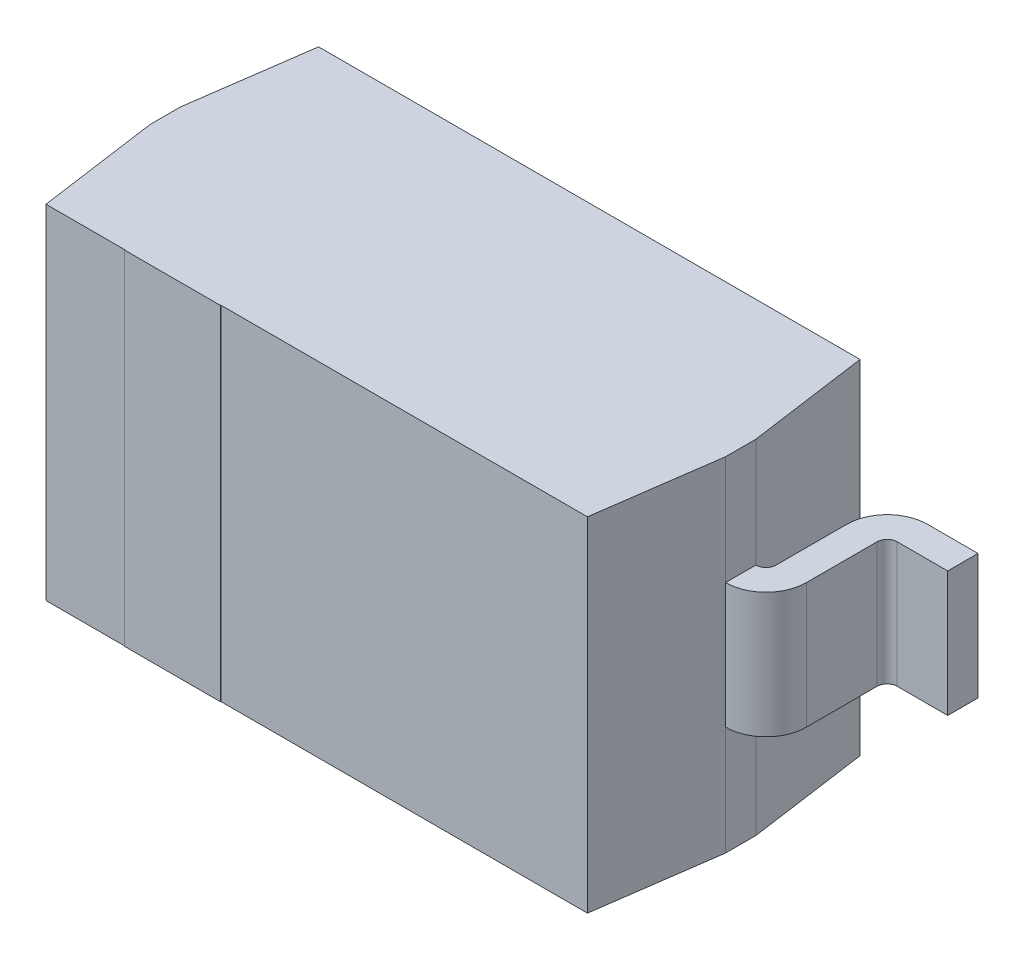
ISO-10303-21;
HEADER;
FILE_DESCRIPTION(('STEP AP214'),'2;1');
FILE_NAME('part.step','',(''),(''),'','','');
FILE_SCHEMA(('AUTOMOTIVE_DESIGN { 1 0 10303 214 1 1 1 1 }'));
ENDSEC;
DATA;
#1=APPLICATION_CONTEXT('core data for automotive mechanical design processes');
#2=APPLICATION_PROTOCOL_DEFINITION('international standard','automotive_design',2000,#1);
#3=PRODUCT_CONTEXT('',#1,'mechanical');
#4=PRODUCT('Part','Part','',(#3));
#5=PRODUCT_RELATED_PRODUCT_CATEGORY('part','',(#4));
#6=PRODUCT_DEFINITION_FORMATION('','',#4);
#7=PRODUCT_DEFINITION_CONTEXT('part definition',#1,'design');
#8=PRODUCT_DEFINITION('design','',#6,#7);
#9=PRODUCT_DEFINITION_SHAPE('','',#8);
#10=(LENGTH_UNIT() NAMED_UNIT(*) SI_UNIT(.MILLI.,.METRE.));
#11=(NAMED_UNIT(*) PLANE_ANGLE_UNIT() SI_UNIT($,.RADIAN.));
#12=(NAMED_UNIT(*) SI_UNIT($,.STERADIAN.) SOLID_ANGLE_UNIT());
#13=UNCERTAINTY_MEASURE_WITH_UNIT(LENGTH_MEASURE(1.E-05),#10,'distance_accuracy_value','');
#14=(GEOMETRIC_REPRESENTATION_CONTEXT(3) GLOBAL_UNCERTAINTY_ASSIGNED_CONTEXT((#13)) GLOBAL_UNIT_ASSIGNED_CONTEXT((#10,
#11,#12)) REPRESENTATION_CONTEXT('',''));
#15=CARTESIAN_POINT('',(0.,0.,0.));
#16=DIRECTION('',(0.,0.,1.));
#17=DIRECTION('',(1.,0.,0.));
#18=AXIS2_PLACEMENT_3D('',#15,#16,#17);
#19=CARTESIAN_POINT('',(-1.38283774958928,0.,1.05));
#20=DIRECTION('',(-0.99026806874157,0.,0.139173100960065));
#21=DIRECTION('',(0.139173100960065,0.,0.99026806874157));
#22=AXIS2_PLACEMENT_3D('',#19,#20,#21);
#23=PLANE('',#22);
#24=DIRECTION('',(0.,1.,0.));
#25=VECTOR('',#24,1.);
#26=CARTESIAN_POINT('',(-1.425,0.,0.749999999999999));
#27=LINE('',#26,#25);
#28=CARTESIAN_POINT('',(-1.425,0.31,0.75));
#29=VERTEX_POINT('',#28);
#30=CARTESIAN_POINT('',(-1.425,-0.31,0.75));
#31=VERTEX_POINT('',#30);
#32=EDGE_CURVE('E222',#29,#31,#27,.F.);
#33=ORIENTED_EDGE('',*,*,#32,.T.);
#34=DIRECTION('',(0.,1.,0.));
#35=VECTOR('',#34,1.);
#36=CARTESIAN_POINT('',(-1.425,0.,0.749999999999999));
#37=LINE('',#36,#35);
#38=CARTESIAN_POINT('',(-1.425,-0.850000000000001,0.749999999999999));
#39=VERTEX_POINT('',#38);
#40=EDGE_CURVE('E225',#31,#39,#37,.F.);
#41=ORIENTED_EDGE('',*,*,#40,.T.);
#42=DIRECTION('',(0.139173100960065,0.,0.99026806874157));
#43=VECTOR('',#42,1.);
#44=CARTESIAN_POINT('',(-1.38283774958928,-0.850000000000001,1.05));
#45=LINE('',#44,#43);
#46=CARTESIAN_POINT('',(-1.34067549917857,-0.850000000000001,1.35));
#47=VERTEX_POINT('',#46);
#48=EDGE_CURVE('E270',#39,#47,#45,.T.);
#49=ORIENTED_EDGE('',*,*,#48,.T.);
#50=DIRECTION('',(0.,1.,0.));
#51=VECTOR('',#50,1.);
#52=CARTESIAN_POINT('',(-1.34067549917857,0.,1.35));
#53=LINE('',#52,#51);
#54=CARTESIAN_POINT('',(-1.34067549917856,0.850000000000001,1.35));
#55=VERTEX_POINT('',#54);
#56=EDGE_CURVE('E259',#47,#55,#53,.T.);
#57=ORIENTED_EDGE('',*,*,#56,.T.);
#58=DIRECTION('',(0.139173100960065,0.,0.99026806874157));
#59=VECTOR('',#58,1.);
#60=CARTESIAN_POINT('',(-1.38283774958928,0.850000000000001,1.05));
#61=LINE('',#60,#59);
#62=CARTESIAN_POINT('',(-1.425,0.850000000000001,0.749999999999999));
#63=VERTEX_POINT('',#62);
#64=EDGE_CURVE('E272',#55,#63,#61,.F.);
#65=ORIENTED_EDGE('',*,*,#64,.T.);
#66=DIRECTION('',(0.,1.,0.));
#67=VECTOR('',#66,1.);
#68=CARTESIAN_POINT('',(-1.425,0.,0.749999999999999));
#69=LINE('',#68,#67);
#70=EDGE_CURVE('E228',#63,#29,#69,.F.);
#71=ORIENTED_EDGE('',*,*,#70,.T.);
#72=EDGE_LOOP('',(#33,#41,#49,#57,#65,#71));
#73=FACE_BOUND('',#72,.T.);
#74=ADVANCED_FACE('F17',(#73),#23,.T.);
#75=CARTESIAN_POINT('',(0.,0.,1.35));
#76=DIRECTION('',(0.,0.,-1.));
#77=DIRECTION('',(0.,1.,0.));
#78=AXIS2_PLACEMENT_3D('',#75,#76,#77);
#79=PLANE('',#78);
#80=ORIENTED_EDGE('',*,*,#56,.F.);
#81=DIRECTION('',(1.,0.,0.));
#82=VECTOR('',#81,1.);
#83=CARTESIAN_POINT('',(0.,-0.85,1.35));
#84=LINE('',#83,#82);
#85=CARTESIAN_POINT('',(-0.95,-0.85,1.35));
#86=VERTEX_POINT('',#85);
#87=EDGE_CURVE('E256',#86,#47,#84,.F.);
#88=ORIENTED_EDGE('',*,*,#87,.F.);
#89=DIRECTION('',(0.,1.,0.));
#90=VECTOR('',#89,1.);
#91=CARTESIAN_POINT('',(-0.95,0.,1.35));
#92=LINE('',#91,#90);
#93=CARTESIAN_POINT('',(-0.95,0.85,1.35));
#94=VERTEX_POINT('',#93);
#95=EDGE_CURVE('E430',#86,#94,#92,.T.);
#96=ORIENTED_EDGE('',*,*,#95,.T.);
#97=DIRECTION('',(1.,0.,0.));
#98=VECTOR('',#97,1.);
#99=CARTESIAN_POINT('',(0.,0.85,1.35));
#100=LINE('',#99,#98);
#101=EDGE_CURVE('E288',#55,#94,#100,.T.);
#102=ORIENTED_EDGE('',*,*,#101,.F.);
#103=EDGE_LOOP('',(#80,#88,#96,#102));
#104=FACE_BOUND('',#103,.T.);
#105=ADVANCED_FACE('F776',(#104),#79,.F.);
#106=CARTESIAN_POINT('',(-0.95,0.,1.351));
#107=DIRECTION('',(1.,0.,0.));
#108=DIRECTION('',(0.,0.,-1.));
#109=AXIS2_PLACEMENT_3D('',#106,#107,#108);
#110=PLANE('',#109);
#111=ORIENTED_EDGE('',*,*,#95,.F.);
#112=DIRECTION('',(0.,0.,-1.));
#113=VECTOR('',#112,1.);
#114=CARTESIAN_POINT('',(-0.95,-0.85,1.351));
#115=LINE('',#114,#113);
#116=CARTESIAN_POINT('',(-0.95,-0.85,1.352));
#117=VERTEX_POINT('',#116);
#118=EDGE_CURVE('E290',#117,#86,#115,.T.);
#119=ORIENTED_EDGE('',*,*,#118,.F.);
#120=DIRECTION('',(0.,1.,0.));
#121=VECTOR('',#120,1.);
#122=CARTESIAN_POINT('',(-0.95,0.,1.352));
#123=LINE('',#122,#121);
#124=CARTESIAN_POINT('',(-0.95,0.85,1.352));
#125=VERTEX_POINT('',#124);
#126=EDGE_CURVE('E393',#117,#125,#123,.T.);
#127=ORIENTED_EDGE('',*,*,#126,.T.);
#128=DIRECTION('',(0.,0.,-1.));
#129=VECTOR('',#128,1.);
#130=CARTESIAN_POINT('',(-0.95,0.85,1.351));
#131=LINE('',#130,#129);
#132=EDGE_CURVE('E418',#94,#125,#131,.F.);
#133=ORIENTED_EDGE('',*,*,#132,.F.);
#134=EDGE_LOOP('',(#111,#119,#127,#133));
#135=FACE_BOUND('',#134,.T.);
#136=ADVANCED_FACE('F439',(#135),#110,.F.);
#137=CARTESIAN_POINT('',(1.625,0.31,0.2));
#138=DIRECTION('',(1.,0.,0.));
#139=DIRECTION('',(0.,0.,-1.));
#140=AXIS2_PLACEMENT_3D('',#137,#138,#139);
#141=PLANE('',#140);
#142=DIRECTION('',(0.,0.,1.));
#143=VECTOR('',#142,1.);
#144=CARTESIAN_POINT('',(1.625,0.31,0.55));
#145=LINE('',#144,#143);
#146=CARTESIAN_POINT('',(1.625,0.31,0.55));
#147=VERTEX_POINT('',#146);
#148=CARTESIAN_POINT('',(1.625,0.31,0.2));
#149=VERTEX_POINT('',#148);
#150=EDGE_CURVE('E330',#147,#149,#145,.F.);
#151=ORIENTED_EDGE('',*,*,#150,.F.);
#152=DIRECTION('',(0.,-1.,0.));
#153=VECTOR('',#152,1.);
#154=CARTESIAN_POINT('',(1.625,0.31,0.55));
#155=LINE('',#154,#153);
#156=CARTESIAN_POINT('',(1.625,-0.31,0.55));
#157=VERTEX_POINT('',#156);
#158=EDGE_CURVE('E390',#157,#147,#155,.F.);
#159=ORIENTED_EDGE('',*,*,#158,.F.);
#160=DIRECTION('',(0.,0.,1.));
#161=VECTOR('',#160,1.);
#162=CARTESIAN_POINT('',(1.625,-0.31,0.55));
#163=LINE('',#162,#161);
#164=CARTESIAN_POINT('',(1.625,-0.31,0.2));
#165=VERTEX_POINT('',#164);
#166=EDGE_CURVE('E344',#157,#165,#163,.F.);
#167=ORIENTED_EDGE('',*,*,#166,.T.);
#168=DIRECTION('',(0.,-1.,0.));
#169=VECTOR('',#168,1.);
#170=CARTESIAN_POINT('',(1.625,0.31,0.2));
#171=LINE('',#170,#169);
#172=EDGE_CURVE('E415',#165,#149,#171,.F.);
#173=ORIENTED_EDGE('',*,*,#172,.T.);
#174=EDGE_LOOP('',(#151,#159,#167,#173));
#175=FACE_BOUND('',#174,.T.);
#176=ADVANCED_FACE('F621',(#175),#141,.T.);
#177=CARTESIAN_POINT('',(1.675,0.31,0.2));
#178=DIRECTION('',(0.,-1.,0.));
#179=DIRECTION('',(0.,0.,-1.));
#180=AXIS2_PLACEMENT_3D('',#177,#178,#179);
#181=CYLINDRICAL_SURFACE('',#180,0.05);
#182=CARTESIAN_POINT('',(1.675,-0.31,0.2));
#183=DIRECTION('',(0.,-1.,0.));
#184=DIRECTION('',(0.,0.,-1.));
#185=AXIS2_PLACEMENT_3D('',#182,#183,#184);
#186=CIRCLE('',#185,0.05);
#187=CARTESIAN_POINT('',(1.675,-0.31,0.15));
#188=VERTEX_POINT('',#187);
#189=EDGE_CURVE('E340',#165,#188,#186,.T.);
#190=ORIENTED_EDGE('',*,*,#189,.T.);
#191=DIRECTION('',(0.,-1.,0.));
#192=VECTOR('',#191,1.);
#193=CARTESIAN_POINT('',(1.675,0.31,0.15));
#194=LINE('',#193,#192);
#195=CARTESIAN_POINT('',(1.675,0.31,0.15));
#196=VERTEX_POINT('',#195);
#197=EDGE_CURVE('E411',#196,#188,#194,.T.);
#198=ORIENTED_EDGE('',*,*,#197,.F.);
#199=CARTESIAN_POINT('',(1.675,0.31,0.2));
#200=DIRECTION('',(0.,-1.,0.));
#201=DIRECTION('',(0.,0.,-1.));
#202=AXIS2_PLACEMENT_3D('',#199,#200,#201);
#203=CIRCLE('',#202,0.05);
#204=EDGE_CURVE('E327',#149,#196,#203,.T.);
#205=ORIENTED_EDGE('',*,*,#204,.F.);
#206=ORIENTED_EDGE('',*,*,#172,.F.);
#207=EDGE_LOOP('',(#190,#198,#205,#206));
#208=FACE_BOUND('',#207,.T.);
#209=ADVANCED_FACE('F627',(#208),#181,.F.);
#210=CARTESIAN_POINT('',(1.925,0.31,0.15));
#211=DIRECTION('',(0.,0.,1.));
#212=DIRECTION('',(0.,-1.,0.));
#213=AXIS2_PLACEMENT_3D('',#210,#211,#212);
#214=PLANE('',#213);
#215=DIRECTION('',(1.,0.,0.));
#216=VECTOR('',#215,1.);
#217=CARTESIAN_POINT('',(1.425,0.31,0.15));
#218=LINE('',#217,#216);
#219=CARTESIAN_POINT('',(1.925,0.31,0.15));
#220=VERTEX_POINT('',#219);
#221=EDGE_CURVE('E329',#196,#220,#218,.T.);
#222=ORIENTED_EDGE('',*,*,#221,.F.);
#223=ORIENTED_EDGE('',*,*,#197,.T.);
#224=DIRECTION('',(1.,0.,0.));
#225=VECTOR('',#224,1.);
#226=CARTESIAN_POINT('',(1.425,-0.31,0.15));
#227=LINE('',#226,#225);
#228=CARTESIAN_POINT('',(1.925,-0.31,0.15));
#229=VERTEX_POINT('',#228);
#230=EDGE_CURVE('E343',#188,#229,#227,.T.);
#231=ORIENTED_EDGE('',*,*,#230,.T.);
#232=DIRECTION('',(0.,1.,0.));
#233=VECTOR('',#232,1.);
#234=CARTESIAN_POINT('',(1.925,0.31,0.15));
#235=LINE('',#234,#233);
#236=EDGE_CURVE('E403',#220,#229,#235,.F.);
#237=ORIENTED_EDGE('',*,*,#236,.F.);
#238=EDGE_LOOP('',(#222,#223,#231,#237));
#239=FACE_BOUND('',#238,.T.);
#240=ADVANCED_FACE('F629',(#239),#214,.T.);
#241=CARTESIAN_POINT('',(1.925,0.31,0.));
#242=DIRECTION('',(1.,0.,0.));
#243=DIRECTION('',(0.,0.,-1.));
#244=AXIS2_PLACEMENT_3D('',#241,#242,#243);
#245=PLANE('',#244);
#246=DIRECTION('',(0.,0.,1.));
#247=VECTOR('',#246,1.);
#248=CARTESIAN_POINT('',(1.925,0.31,0.55));
#249=LINE('',#248,#247);
#250=CARTESIAN_POINT('',(1.925,0.31,0.));
#251=VERTEX_POINT('',#250);
#252=EDGE_CURVE('E406',#220,#251,#249,.F.);
#253=ORIENTED_EDGE('',*,*,#252,.F.);
#254=ORIENTED_EDGE('',*,*,#236,.T.);
#255=DIRECTION('',(0.,0.,1.));
#256=VECTOR('',#255,1.);
#257=CARTESIAN_POINT('',(1.925,-0.31,0.55));
#258=LINE('',#257,#256);
#259=CARTESIAN_POINT('',(1.925,-0.31,0.));
#260=VERTEX_POINT('',#259);
#261=EDGE_CURVE('E421',#229,#260,#258,.F.);
#262=ORIENTED_EDGE('',*,*,#261,.T.);
#263=DIRECTION('',(0.,1.,0.));
#264=VECTOR('',#263,1.);
#265=CARTESIAN_POINT('',(1.925,0.31,0.));
#266=LINE('',#265,#264);
#267=EDGE_CURVE('E401',#251,#260,#266,.F.);
#268=ORIENTED_EDGE('',*,*,#267,.F.);
#269=EDGE_LOOP('',(#253,#254,#262,#268));
#270=FACE_BOUND('',#269,.T.);
#271=ADVANCED_FACE('F634',(#270),#245,.T.);
#272=CARTESIAN_POINT('',(1.675,0.31,0.));
#273=DIRECTION('',(0.,0.,-1.));
#274=DIRECTION('',(0.,1.,0.));
#275=AXIS2_PLACEMENT_3D('',#272,#273,#274);
#276=PLANE('',#275);
#277=DIRECTION('',(1.,0.,0.));
#278=VECTOR('',#277,1.);
#279=CARTESIAN_POINT('',(1.425,0.31,0.));
#280=LINE('',#279,#278);
#281=CARTESIAN_POINT('',(1.675,0.31,0.));
#282=VERTEX_POINT('',#281);
#283=EDGE_CURVE('E326',#251,#282,#280,.F.);
#284=ORIENTED_EDGE('',*,*,#283,.F.);
#285=ORIENTED_EDGE('',*,*,#267,.T.);
#286=DIRECTION('',(1.,0.,0.));
#287=VECTOR('',#286,1.);
#288=CARTESIAN_POINT('',(1.425,-0.31,0.));
#289=LINE('',#288,#287);
#290=CARTESIAN_POINT('',(1.675,-0.31,0.));
#291=VERTEX_POINT('',#290);
#292=EDGE_CURVE('E339',#260,#291,#289,.F.);
#293=ORIENTED_EDGE('',*,*,#292,.T.);
#294=DIRECTION('',(0.,-1.,0.));
#295=VECTOR('',#294,1.);
#296=CARTESIAN_POINT('',(1.675,0.31,0.));
#297=LINE('',#296,#295);
#298=EDGE_CURVE('E399',#282,#291,#297,.T.);
#299=ORIENTED_EDGE('',*,*,#298,.F.);
#300=EDGE_LOOP('',(#284,#285,#293,#299));
#301=FACE_BOUND('',#300,.T.);
#302=ADVANCED_FACE('F639',(#301),#276,.T.);
#303=CARTESIAN_POINT('',(1.675,0.31,0.2));
#304=DIRECTION('',(0.,-1.,0.));
#305=DIRECTION('',(0.,0.,-1.));
#306=AXIS2_PLACEMENT_3D('',#303,#304,#305);
#307=CYLINDRICAL_SURFACE('',#306,0.2);
#308=CARTESIAN_POINT('',(1.675,0.31,0.2));
#309=DIRECTION('',(0.,-1.,0.));
#310=DIRECTION('',(0.,0.,-1.));
#311=AXIS2_PLACEMENT_3D('',#308,#309,#310);
#312=CIRCLE('',#311,0.2);
#313=CARTESIAN_POINT('',(1.475,0.31,0.2));
#314=VERTEX_POINT('',#313);
#315=EDGE_CURVE('E322',#282,#314,#312,.F.);
#316=ORIENTED_EDGE('',*,*,#315,.F.);
#317=ORIENTED_EDGE('',*,*,#298,.T.);
#318=CARTESIAN_POINT('',(1.675,-0.31,0.2));
#319=DIRECTION('',(0.,-1.,0.));
#320=DIRECTION('',(0.,0.,-1.));
#321=AXIS2_PLACEMENT_3D('',#318,#319,#320);
#322=CIRCLE('',#321,0.2);
#323=CARTESIAN_POINT('',(1.475,-0.31,0.2));
#324=VERTEX_POINT('',#323);
#325=EDGE_CURVE('E335',#291,#324,#322,.F.);
#326=ORIENTED_EDGE('',*,*,#325,.T.);
#327=DIRECTION('',(0.,1.,0.));
#328=VECTOR('',#327,1.);
#329=CARTESIAN_POINT('',(1.475,0.31,0.2));
#330=LINE('',#329,#328);
#331=EDGE_CURVE('E348',#314,#324,#330,.F.);
#332=ORIENTED_EDGE('',*,*,#331,.F.);
#333=EDGE_LOOP('',(#316,#317,#326,#332));
#334=FACE_BOUND('',#333,.T.);
#335=ADVANCED_FACE('F643',(#334),#307,.T.);
#336=CARTESIAN_POINT('',(-0.7125,0.,1.352));
#337=DIRECTION('',(0.,0.,-1.));
#338=DIRECTION('',(0.,1.,0.));
#339=AXIS2_PLACEMENT_3D('',#336,#337,#338);
#340=PLANE('',#339);
#341=ORIENTED_EDGE('',*,*,#126,.F.);
#342=DIRECTION('',(1.,0.,0.));
#343=VECTOR('',#342,1.);
#344=CARTESIAN_POINT('',(-0.7125,-0.85,1.352));
#345=LINE('',#344,#343);
#346=CARTESIAN_POINT('',(-0.475,-0.85,1.352));
#347=VERTEX_POINT('',#346);
#348=EDGE_CURVE('E396',#347,#117,#345,.F.);
#349=ORIENTED_EDGE('',*,*,#348,.F.);
#350=DIRECTION('',(0.,1.,0.));
#351=VECTOR('',#350,1.);
#352=CARTESIAN_POINT('',(-0.475,0.,1.352));
#353=LINE('',#352,#351);
#354=CARTESIAN_POINT('',(-0.475,0.85,1.352));
#355=VERTEX_POINT('',#354);
#356=EDGE_CURVE('E446',#347,#355,#353,.T.);
#357=ORIENTED_EDGE('',*,*,#356,.T.);
#358=DIRECTION('',(1.,0.,0.));
#359=VECTOR('',#358,1.);
#360=CARTESIAN_POINT('',(-0.7125,0.85,1.352));
#361=LINE('',#360,#359);
#362=EDGE_CURVE('E391',#125,#355,#361,.T.);
#363=ORIENTED_EDGE('',*,*,#362,.F.);
#364=EDGE_LOOP('',(#341,#349,#357,#363));
#365=FACE_BOUND('',#364,.T.);
#366=ADVANCED_FACE('F443',(#365),#340,.F.);
#367=CARTESIAN_POINT('',(1.425,0.31,0.55));
#368=DIRECTION('',(0.,-1.,0.));
#369=DIRECTION('',(0.,0.,-1.));
#370=AXIS2_PLACEMENT_3D('',#367,#368,#369);
#371=CYLINDRICAL_SURFACE('',#370,0.2);
#372=CARTESIAN_POINT('',(1.425,0.31,0.55));
#373=DIRECTION('',(0.,-1.,0.));
#374=DIRECTION('',(0.,0.,-1.));
#375=AXIS2_PLACEMENT_3D('',#372,#373,#374);
#376=CIRCLE('',#375,0.2);
#377=CARTESIAN_POINT('',(1.425,0.31,0.75));
#378=VERTEX_POINT('',#377);
#379=EDGE_CURVE('E331',#378,#147,#376,.F.);
#380=ORIENTED_EDGE('',*,*,#379,.F.);
#381=DIRECTION('',(0.,1.,0.));
#382=VECTOR('',#381,1.);
#383=CARTESIAN_POINT('',(1.425,0.,0.75));
#384=LINE('',#383,#382);
#385=CARTESIAN_POINT('',(1.425,-0.31,0.75));
#386=VERTEX_POINT('',#385);
#387=EDGE_CURVE('E457',#386,#378,#384,.T.);
#388=ORIENTED_EDGE('',*,*,#387,.F.);
#389=CARTESIAN_POINT('',(1.425,-0.31,0.55));
#390=DIRECTION('',(0.,-1.,0.));
#391=DIRECTION('',(0.,0.,-1.));
#392=AXIS2_PLACEMENT_3D('',#389,#390,#391);
#393=CIRCLE('',#392,0.2);
#394=EDGE_CURVE('E345',#386,#157,#393,.F.);
#395=ORIENTED_EDGE('',*,*,#394,.T.);
#396=ORIENTED_EDGE('',*,*,#158,.T.);
#397=EDGE_LOOP('',(#380,#388,#395,#396));
#398=FACE_BOUND('',#397,.T.);
#399=ADVANCED_FACE('F602',(#398),#371,.T.);
#400=CARTESIAN_POINT('',(-1.425,-0.31,0.55));
#401=DIRECTION('',(0.,1.,0.));
#402=DIRECTION('',(-1.,0.,0.));
#403=AXIS2_PLACEMENT_3D('',#400,#401,#402);
#404=CYLINDRICAL_SURFACE('',#403,0.2);
#405=CARTESIAN_POINT('',(-1.425,-0.31,0.55));
#406=DIRECTION('',(0.,1.,0.));
#407=DIRECTION('',(-1.,0.,0.));
#408=AXIS2_PLACEMENT_3D('',#405,#406,#407);
#409=CIRCLE('',#408,0.2);
#410=CARTESIAN_POINT('',(-1.625,-0.31,0.55));
#411=VERTEX_POINT('',#410);
#412=EDGE_CURVE('E20',#31,#411,#409,.F.);
#413=ORIENTED_EDGE('',*,*,#412,.F.);
#414=ORIENTED_EDGE('',*,*,#32,.F.);
#415=CARTESIAN_POINT('',(-1.425,0.31,0.55));
#416=DIRECTION('',(0.,1.,0.));
#417=DIRECTION('',(-1.,0.,0.));
#418=AXIS2_PLACEMENT_3D('',#415,#416,#417);
#419=CIRCLE('',#418,0.2);
#420=CARTESIAN_POINT('',(-1.625,0.31,0.55));
#421=VERTEX_POINT('',#420);
#422=EDGE_CURVE('E319',#29,#421,#419,.F.);
#423=ORIENTED_EDGE('',*,*,#422,.T.);
#424=DIRECTION('',(0.,-1.,0.));
#425=VECTOR('',#424,1.);
#426=CARTESIAN_POINT('',(-1.625,-0.31,0.55));
#427=LINE('',#426,#425);
#428=EDGE_CURVE('E249',#411,#421,#427,.F.);
#429=ORIENTED_EDGE('',*,*,#428,.F.);
#430=EDGE_LOOP('',(#413,#414,#423,#429));
#431=FACE_BOUND('',#430,.T.);
#432=ADVANCED_FACE('F248',(#431),#404,.T.);
#433=CARTESIAN_POINT('',(-1.625,-0.31,0.2));
#434=DIRECTION('',(-1.,0.,0.));
#435=DIRECTION('',(0.,-1.,0.));
#436=AXIS2_PLACEMENT_3D('',#433,#434,#435);
#437=PLANE('',#436);
#438=DIRECTION('',(0.,0.,1.));
#439=VECTOR('',#438,1.);
#440=CARTESIAN_POINT('',(-1.625,-0.31,0.55));
#441=LINE('',#440,#439);
#442=CARTESIAN_POINT('',(-1.625,-0.31,0.2));
#443=VERTEX_POINT('',#442);
#444=EDGE_CURVE('E251',#411,#443,#441,.F.);
#445=ORIENTED_EDGE('',*,*,#444,.F.);
#446=ORIENTED_EDGE('',*,*,#428,.T.);
#447=DIRECTION('',(0.,0.,1.));
#448=VECTOR('',#447,1.);
#449=CARTESIAN_POINT('',(-1.625,0.31,0.55));
#450=LINE('',#449,#448);
#451=CARTESIAN_POINT('',(-1.625,0.31,0.2));
#452=VERTEX_POINT('',#451);
#453=EDGE_CURVE('E318',#421,#452,#450,.F.);
#454=ORIENTED_EDGE('',*,*,#453,.T.);
#455=DIRECTION('',(0.,1.,0.));
#456=VECTOR('',#455,1.);
#457=CARTESIAN_POINT('',(-1.625,-0.31,0.2));
#458=LINE('',#457,#456);
#459=EDGE_CURVE('E387',#452,#443,#458,.F.);
#460=ORIENTED_EDGE('',*,*,#459,.T.);
#461=EDGE_LOOP('',(#445,#446,#454,#460));
#462=FACE_BOUND('',#461,.T.);
#463=ADVANCED_FACE('F934',(#462),#437,.T.);
#464=CARTESIAN_POINT('',(-1.675,-0.31,0.2));
#465=DIRECTION('',(0.,1.,0.));
#466=DIRECTION('',(-1.,0.,0.));
#467=AXIS2_PLACEMENT_3D('',#464,#465,#466);
#468=CYLINDRICAL_SURFACE('',#467,0.0499999999999999);
#469=CARTESIAN_POINT('',(-1.675,0.31,0.2));
#470=DIRECTION('',(0.,1.,0.));
#471=DIRECTION('',(-1.,0.,0.));
#472=AXIS2_PLACEMENT_3D('',#469,#470,#471);
#473=CIRCLE('',#472,0.0499999999999999);
#474=CARTESIAN_POINT('',(-1.675,0.31,0.15));
#475=VERTEX_POINT('',#474);
#476=EDGE_CURVE('E314',#452,#475,#473,.T.);
#477=ORIENTED_EDGE('',*,*,#476,.T.);
#478=DIRECTION('',(0.,-1.,0.));
#479=VECTOR('',#478,1.);
#480=CARTESIAN_POINT('',(-1.675,-0.31,0.15));
#481=LINE('',#480,#479);
#482=CARTESIAN_POINT('',(-1.675,-0.31,0.15));
#483=VERTEX_POINT('',#482);
#484=EDGE_CURVE('E383',#483,#475,#481,.F.);
#485=ORIENTED_EDGE('',*,*,#484,.F.);
#486=CARTESIAN_POINT('',(-1.675,-0.31,0.2));
#487=DIRECTION('',(0.,1.,0.));
#488=DIRECTION('',(-1.,0.,0.));
#489=AXIS2_PLACEMENT_3D('',#486,#487,#488);
#490=CIRCLE('',#489,0.0499999999999999);
#491=EDGE_CURVE('E352',#443,#483,#490,.T.);
#492=ORIENTED_EDGE('',*,*,#491,.F.);
#493=ORIENTED_EDGE('',*,*,#459,.F.);
#494=EDGE_LOOP('',(#477,#485,#492,#493));
#495=FACE_BOUND('',#494,.T.);
#496=ADVANCED_FACE('F941',(#495),#468,.F.);
#497=CARTESIAN_POINT('',(-1.925,-0.31,0.15));
#498=DIRECTION('',(0.,0.,1.));
#499=DIRECTION('',(0.,-1.,0.));
#500=AXIS2_PLACEMENT_3D('',#497,#498,#499);
#501=PLANE('',#500);
#502=DIRECTION('',(1.,0.,0.));
#503=VECTOR('',#502,1.);
#504=CARTESIAN_POINT('',(-1.425,-0.31,0.15));
#505=LINE('',#504,#503);
#506=CARTESIAN_POINT('',(-1.925,-0.31,0.15));
#507=VERTEX_POINT('',#506);
#508=EDGE_CURVE('E353',#483,#507,#505,.F.);
#509=ORIENTED_EDGE('',*,*,#508,.F.);
#510=ORIENTED_EDGE('',*,*,#484,.T.);
#511=DIRECTION('',(1.,0.,0.));
#512=VECTOR('',#511,1.);
#513=CARTESIAN_POINT('',(-1.425,0.31,0.15));
#514=LINE('',#513,#512);
#515=CARTESIAN_POINT('',(-1.925,0.31,0.15));
#516=VERTEX_POINT('',#515);
#517=EDGE_CURVE('E317',#475,#516,#514,.F.);
#518=ORIENTED_EDGE('',*,*,#517,.T.);
#519=DIRECTION('',(0.,-1.,0.));
#520=VECTOR('',#519,1.);
#521=CARTESIAN_POINT('',(-1.925,-0.31,0.15));
#522=LINE('',#521,#520);
#523=EDGE_CURVE('E374',#507,#516,#522,.F.);
#524=ORIENTED_EDGE('',*,*,#523,.F.);
#525=EDGE_LOOP('',(#509,#510,#518,#524));
#526=FACE_BOUND('',#525,.T.);
#527=ADVANCED_FACE('F949',(#526),#501,.T.);
#528=CARTESIAN_POINT('',(-1.925,-0.31,0.));
#529=DIRECTION('',(-1.,0.,0.));
#530=DIRECTION('',(0.,-1.,0.));
#531=AXIS2_PLACEMENT_3D('',#528,#529,#530);
#532=PLANE('',#531);
#533=DIRECTION('',(0.,0.,1.));
#534=VECTOR('',#533,1.);
#535=CARTESIAN_POINT('',(-1.925,-0.31,0.55));
#536=LINE('',#535,#534);
#537=CARTESIAN_POINT('',(-1.925,-0.31,0.));
#538=VERTEX_POINT('',#537);
#539=EDGE_CURVE('E356',#507,#538,#536,.F.);
#540=ORIENTED_EDGE('',*,*,#539,.F.);
#541=ORIENTED_EDGE('',*,*,#523,.T.);
#542=DIRECTION('',(0.,0.,1.));
#543=VECTOR('',#542,1.);
#544=CARTESIAN_POINT('',(-1.925,0.31,0.55));
#545=LINE('',#544,#543);
#546=CARTESIAN_POINT('',(-1.925,0.31,0.));
#547=VERTEX_POINT('',#546);
#548=EDGE_CURVE('E377',#516,#547,#545,.F.);
#549=ORIENTED_EDGE('',*,*,#548,.T.);
#550=DIRECTION('',(0.,1.,0.));
#551=VECTOR('',#550,1.);
#552=CARTESIAN_POINT('',(-1.925,-0.31,0.));
#553=LINE('',#552,#551);
#554=EDGE_CURVE('E372',#538,#547,#553,.T.);
#555=ORIENTED_EDGE('',*,*,#554,.F.);
#556=EDGE_LOOP('',(#540,#541,#549,#555));
#557=FACE_BOUND('',#556,.T.);
#558=ADVANCED_FACE('F957',(#557),#532,.T.);
#559=CARTESIAN_POINT('',(-1.675,-0.31,0.));
#560=DIRECTION('',(0.,0.,-1.));
#561=DIRECTION('',(0.,1.,0.));
#562=AXIS2_PLACEMENT_3D('',#559,#560,#561);
#563=PLANE('',#562);
#564=DIRECTION('',(1.,0.,0.));
#565=VECTOR('',#564,1.);
#566=CARTESIAN_POINT('',(-1.425,-0.31,0.));
#567=LINE('',#566,#565);
#568=CARTESIAN_POINT('',(-1.675,-0.31,0.));
#569=VERTEX_POINT('',#568);
#570=EDGE_CURVE('E351',#538,#569,#567,.T.);
#571=ORIENTED_EDGE('',*,*,#570,.F.);
#572=ORIENTED_EDGE('',*,*,#554,.T.);
#573=DIRECTION('',(1.,0.,0.));
#574=VECTOR('',#573,1.);
#575=CARTESIAN_POINT('',(-1.425,0.31,0.));
#576=LINE('',#575,#574);
#577=CARTESIAN_POINT('',(-1.675,0.31,0.));
#578=VERTEX_POINT('',#577);
#579=EDGE_CURVE('E313',#547,#578,#576,.T.);
#580=ORIENTED_EDGE('',*,*,#579,.T.);
#581=DIRECTION('',(0.,1.,0.));
#582=VECTOR('',#581,1.);
#583=CARTESIAN_POINT('',(-1.675,-0.31,0.));
#584=LINE('',#583,#582);
#585=EDGE_CURVE('E370',#569,#578,#584,.T.);
#586=ORIENTED_EDGE('',*,*,#585,.F.);
#587=EDGE_LOOP('',(#571,#572,#580,#586));
#588=FACE_BOUND('',#587,.T.);
#589=ADVANCED_FACE('F520',(#588),#563,.T.);
#590=CARTESIAN_POINT('',(-1.675,-0.31,0.2));
#591=DIRECTION('',(0.,1.,0.));
#592=DIRECTION('',(-1.,0.,0.));
#593=AXIS2_PLACEMENT_3D('',#590,#591,#592);
#594=CYLINDRICAL_SURFACE('',#593,0.2);
#595=CARTESIAN_POINT('',(-1.675,-0.31,0.2));
#596=DIRECTION('',(0.,1.,0.));
#597=DIRECTION('',(-1.,0.,0.));
#598=AXIS2_PLACEMENT_3D('',#595,#596,#597);
#599=CIRCLE('',#598,0.2);
#600=CARTESIAN_POINT('',(-1.475,-0.31,0.2));
#601=VERTEX_POINT('',#600);
#602=EDGE_CURVE('E349',#569,#601,#599,.F.);
#603=ORIENTED_EDGE('',*,*,#602,.F.);
#604=ORIENTED_EDGE('',*,*,#585,.T.);
#605=CARTESIAN_POINT('',(-1.675,0.31,0.2));
#606=DIRECTION('',(0.,1.,0.));
#607=DIRECTION('',(-1.,0.,0.));
#608=AXIS2_PLACEMENT_3D('',#605,#606,#607);
#609=CIRCLE('',#608,0.2);
#610=CARTESIAN_POINT('',(-1.475,0.31,0.2));
#611=VERTEX_POINT('',#610);
#612=EDGE_CURVE('E310',#578,#611,#609,.F.);
#613=ORIENTED_EDGE('',*,*,#612,.T.);
#614=DIRECTION('',(0.,1.,0.));
#615=VECTOR('',#614,1.);
#616=CARTESIAN_POINT('',(-1.475,-0.31,0.2));
#617=LINE('',#616,#615);
#618=EDGE_CURVE('E364',#601,#611,#617,.T.);
#619=ORIENTED_EDGE('',*,*,#618,.F.);
#620=EDGE_LOOP('',(#603,#604,#613,#619));
#621=FACE_BOUND('',#620,.T.);
#622=ADVANCED_FACE('F524',(#621),#594,.T.);
#623=CARTESIAN_POINT('',(-1.475,-0.31,0.55));
#624=DIRECTION('',(1.,0.,0.));
#625=DIRECTION('',(0.,1.,0.));
#626=AXIS2_PLACEMENT_3D('',#623,#624,#625);
#627=PLANE('',#626);
#628=DIRECTION('',(0.,0.,1.));
#629=VECTOR('',#628,1.);
#630=CARTESIAN_POINT('',(-1.475,-0.31,0.55));
#631=LINE('',#630,#629);
#632=CARTESIAN_POINT('',(-1.475,-0.31,0.55));
#633=VERTEX_POINT('',#632);
#634=EDGE_CURVE('E252',#601,#633,#631,.T.);
#635=ORIENTED_EDGE('',*,*,#634,.F.);
#636=ORIENTED_EDGE('',*,*,#618,.T.);
#637=DIRECTION('',(0.,0.,1.));
#638=VECTOR('',#637,1.);
#639=CARTESIAN_POINT('',(-1.475,0.31,0.55));
#640=LINE('',#639,#638);
#641=CARTESIAN_POINT('',(-1.475,0.31,0.55));
#642=VERTEX_POINT('',#641);
#643=EDGE_CURVE('E309',#611,#642,#640,.T.);
#644=ORIENTED_EDGE('',*,*,#643,.T.);
#645=DIRECTION('',(0.,1.,0.));
#646=VECTOR('',#645,1.);
#647=CARTESIAN_POINT('',(-1.475,-0.31,0.55));
#648=LINE('',#647,#646);
#649=EDGE_CURVE('E246',#642,#633,#648,.F.);
#650=ORIENTED_EDGE('',*,*,#649,.T.);
#651=EDGE_LOOP('',(#635,#636,#644,#650));
#652=FACE_BOUND('',#651,.T.);
#653=ADVANCED_FACE('F527',(#652),#627,.T.);
#654=CARTESIAN_POINT('',(-1.425,-0.31,0.55));
#655=DIRECTION('',(0.,-1.,0.));
#656=DIRECTION('',(1.,0.,0.));
#657=AXIS2_PLACEMENT_3D('',#654,#655,#656);
#658=PLANE('',#657);
#659=ORIENTED_EDGE('',*,*,#570,.T.);
#660=ORIENTED_EDGE('',*,*,#602,.T.);
#661=ORIENTED_EDGE('',*,*,#634,.T.);
#662=CARTESIAN_POINT('',(-1.425,-0.31,0.55));
#663=DIRECTION('',(0.,1.,0.));
#664=DIRECTION('',(-1.,0.,0.));
#665=AXIS2_PLACEMENT_3D('',#662,#663,#664);
#666=CIRCLE('',#665,0.0499999999999999);
#667=CARTESIAN_POINT('',(-1.425,-0.31,0.6));
#668=VERTEX_POINT('',#667);
#669=EDGE_CURVE('E241',#633,#668,#666,.T.);
#670=ORIENTED_EDGE('',*,*,#669,.T.);
#671=DIRECTION('',(0.,0.,-1.));
#672=VECTOR('',#671,1.);
#673=CARTESIAN_POINT('',(-1.425,-0.31,0.675));
#674=LINE('',#673,#672);
#675=EDGE_CURVE('E237',#668,#31,#674,.F.);
#676=ORIENTED_EDGE('',*,*,#675,.T.);
#677=ORIENTED_EDGE('',*,*,#412,.T.);
#678=ORIENTED_EDGE('',*,*,#444,.T.);
#679=ORIENTED_EDGE('',*,*,#491,.T.);
#680=ORIENTED_EDGE('',*,*,#508,.T.);
#681=ORIENTED_EDGE('',*,*,#539,.T.);
#682=EDGE_LOOP('',(#659,#660,#661,#670,#676,#677,#678,#679,#680,#681));
#683=FACE_BOUND('',#682,.T.);
#684=ADVANCED_FACE('F238',(#683),#658,.T.);
#685=CARTESIAN_POINT('',(1.475,0.31,0.55));
#686=DIRECTION('',(-1.,0.,0.));
#687=DIRECTION('',(0.,0.,1.));
#688=AXIS2_PLACEMENT_3D('',#685,#686,#687);
#689=PLANE('',#688);
#690=DIRECTION('',(0.,0.,1.));
#691=VECTOR('',#690,1.);
#692=CARTESIAN_POINT('',(1.475,0.31,0.55));
#693=LINE('',#692,#691);
#694=CARTESIAN_POINT('',(1.475,0.31,0.55));
#695=VERTEX_POINT('',#694);
#696=EDGE_CURVE('E334',#314,#695,#693,.T.);
#697=ORIENTED_EDGE('',*,*,#696,.F.);
#698=ORIENTED_EDGE('',*,*,#331,.T.);
#699=DIRECTION('',(0.,0.,1.));
#700=VECTOR('',#699,1.);
#701=CARTESIAN_POINT('',(1.475,-0.31,0.55));
#702=LINE('',#701,#700);
#703=CARTESIAN_POINT('',(1.475,-0.31,0.55));
#704=VERTEX_POINT('',#703);
#705=EDGE_CURVE('E338',#324,#704,#702,.T.);
#706=ORIENTED_EDGE('',*,*,#705,.T.);
#707=DIRECTION('',(0.,-1.,0.));
#708=VECTOR('',#707,1.);
#709=CARTESIAN_POINT('',(1.475,0.31,0.55));
#710=LINE('',#709,#708);
#711=EDGE_CURVE('E302',#704,#695,#710,.F.);
#712=ORIENTED_EDGE('',*,*,#711,.T.);
#713=EDGE_LOOP('',(#697,#698,#706,#712));
#714=FACE_BOUND('',#713,.T.);
#715=ADVANCED_FACE('F645',(#714),#689,.T.);
#716=CARTESIAN_POINT('',(1.425,-0.31,0.55));
#717=DIRECTION('',(0.,1.,0.));
#718=DIRECTION('',(0.,0.,1.));
#719=AXIS2_PLACEMENT_3D('',#716,#717,#718);
#720=PLANE('',#719);
#721=ORIENTED_EDGE('',*,*,#705,.F.);
#722=ORIENTED_EDGE('',*,*,#325,.F.);
#723=ORIENTED_EDGE('',*,*,#292,.F.);
#724=ORIENTED_EDGE('',*,*,#261,.F.);
#725=ORIENTED_EDGE('',*,*,#230,.F.);
#726=ORIENTED_EDGE('',*,*,#189,.F.);
#727=ORIENTED_EDGE('',*,*,#166,.F.);
#728=ORIENTED_EDGE('',*,*,#394,.F.);
#729=DIRECTION('',(0.,0.,1.));
#730=VECTOR('',#729,1.);
#731=CARTESIAN_POINT('',(1.425,-0.31,0.675));
#732=LINE('',#731,#730);
#733=CARTESIAN_POINT('',(1.425,-0.31,0.6));
#734=VERTEX_POINT('',#733);
#735=EDGE_CURVE('E500',#386,#734,#732,.F.);
#736=ORIENTED_EDGE('',*,*,#735,.T.);
#737=CARTESIAN_POINT('',(1.425,-0.31,0.55));
#738=DIRECTION('',(0.,-1.,0.));
#739=DIRECTION('',(0.,0.,-1.));
#740=AXIS2_PLACEMENT_3D('',#737,#738,#739);
#741=CIRCLE('',#740,0.05);
#742=EDGE_CURVE('E299',#734,#704,#741,.F.);
#743=ORIENTED_EDGE('',*,*,#742,.T.);
#744=EDGE_LOOP('',(#721,#722,#723,#724,#725,#726,#727,#728,#736,#743));
#745=FACE_BOUND('',#744,.T.);
#746=ADVANCED_FACE('F616',(#745),#720,.F.);
#747=CARTESIAN_POINT('',(1.425,0.31,0.55));
#748=DIRECTION('',(0.,1.,0.));
#749=DIRECTION('',(0.,0.,1.));
#750=AXIS2_PLACEMENT_3D('',#747,#748,#749);
#751=PLANE('',#750);
#752=ORIENTED_EDGE('',*,*,#283,.T.);
#753=ORIENTED_EDGE('',*,*,#315,.T.);
#754=ORIENTED_EDGE('',*,*,#696,.T.);
#755=CARTESIAN_POINT('',(1.425,0.31,0.55));
#756=DIRECTION('',(0.,-1.,0.));
#757=DIRECTION('',(0.,0.,-1.));
#758=AXIS2_PLACEMENT_3D('',#755,#756,#757);
#759=CIRCLE('',#758,0.05);
#760=CARTESIAN_POINT('',(1.425,0.31,0.6));
#761=VERTEX_POINT('',#760);
#762=EDGE_CURVE('E245',#695,#761,#759,.T.);
#763=ORIENTED_EDGE('',*,*,#762,.T.);
#764=DIRECTION('',(0.,0.,1.));
#765=VECTOR('',#764,1.);
#766=CARTESIAN_POINT('',(1.425,0.31,0.675));
#767=LINE('',#766,#765);
#768=EDGE_CURVE('E479',#761,#378,#767,.T.);
#769=ORIENTED_EDGE('',*,*,#768,.T.);
#770=ORIENTED_EDGE('',*,*,#379,.T.);
#771=ORIENTED_EDGE('',*,*,#150,.T.);
#772=ORIENTED_EDGE('',*,*,#204,.T.);
#773=ORIENTED_EDGE('',*,*,#221,.T.);
#774=ORIENTED_EDGE('',*,*,#252,.T.);
#775=EDGE_LOOP('',(#752,#753,#754,#763,#769,#770,#771,#772,#773,#774));
#776=FACE_BOUND('',#775,.T.);
#777=ADVANCED_FACE('F607',(#776),#751,.T.);
#778=CARTESIAN_POINT('',(-0.475,0.,1.351));
#779=DIRECTION('',(-1.,0.,0.));
#780=DIRECTION('',(0.,0.,1.));
#781=AXIS2_PLACEMENT_3D('',#778,#779,#780);
#782=PLANE('',#781);
#783=ORIENTED_EDGE('',*,*,#356,.F.);
#784=DIRECTION('',(0.,0.,1.));
#785=VECTOR('',#784,1.);
#786=CARTESIAN_POINT('',(-0.475,-0.85,1.351));
#787=LINE('',#786,#785);
#788=CARTESIAN_POINT('',(-0.475,-0.85,1.35));
#789=VERTEX_POINT('',#788);
#790=EDGE_CURVE('E325',#789,#347,#787,.T.);
#791=ORIENTED_EDGE('',*,*,#790,.F.);
#792=DIRECTION('',(0.,1.,0.));
#793=VECTOR('',#792,1.);
#794=CARTESIAN_POINT('',(-0.475,0.,1.35));
#795=LINE('',#794,#793);
#796=CARTESIAN_POINT('',(-0.475,0.85,1.35));
#797=VERTEX_POINT('',#796);
#798=EDGE_CURVE('E455',#789,#797,#795,.T.);
#799=ORIENTED_EDGE('',*,*,#798,.T.);
#800=DIRECTION('',(0.,0.,1.));
#801=VECTOR('',#800,1.);
#802=CARTESIAN_POINT('',(-0.475,0.85,1.351));
#803=LINE('',#802,#801);
#804=EDGE_CURVE('E450',#355,#797,#803,.F.);
#805=ORIENTED_EDGE('',*,*,#804,.F.);
#806=EDGE_LOOP('',(#783,#791,#799,#805));
#807=FACE_BOUND('',#806,.T.);
#808=ADVANCED_FACE('F453',(#807),#782,.F.);
#809=CARTESIAN_POINT('',(1.38283774958928,0.,1.05));
#810=DIRECTION('',(0.99026806874157,0.,0.139173100960066));
#811=DIRECTION('',(0.139173100960066,0.,-0.99026806874157));
#812=AXIS2_PLACEMENT_3D('',#809,#810,#811);
#813=PLANE('',#812);
#814=DIRECTION('',(0.139173100960066,0.,-0.99026806874157));
#815=VECTOR('',#814,1.);
#816=CARTESIAN_POINT('',(1.38283774958928,-0.85,1.05));
#817=LINE('',#816,#815);
#818=CARTESIAN_POINT('',(1.34067549917856,-0.85,1.35));
#819=VERTEX_POINT('',#818);
#820=CARTESIAN_POINT('',(1.425,-0.85,0.749999999999999));
#821=VERTEX_POINT('',#820);
#822=EDGE_CURVE('E321',#819,#821,#817,.T.);
#823=ORIENTED_EDGE('',*,*,#822,.T.);
#824=DIRECTION('',(0.,1.,0.));
#825=VECTOR('',#824,1.);
#826=CARTESIAN_POINT('',(1.425,0.,0.75));
#827=LINE('',#826,#825);
#828=EDGE_CURVE('E483',#821,#386,#827,.T.);
#829=ORIENTED_EDGE('',*,*,#828,.T.);
#830=ORIENTED_EDGE('',*,*,#387,.T.);
#831=DIRECTION('',(0.,1.,0.));
#832=VECTOR('',#831,1.);
#833=CARTESIAN_POINT('',(1.425,0.,0.75));
#834=LINE('',#833,#832);
#835=CARTESIAN_POINT('',(1.425,0.85,0.75));
#836=VERTEX_POINT('',#835);
#837=EDGE_CURVE('E482',#378,#836,#834,.T.);
#838=ORIENTED_EDGE('',*,*,#837,.T.);
#839=DIRECTION('',(0.139173100960066,0.,-0.99026806874157));
#840=VECTOR('',#839,1.);
#841=CARTESIAN_POINT('',(1.38283774958928,0.85,1.05));
#842=LINE('',#841,#840);
#843=CARTESIAN_POINT('',(1.34067549917856,0.85,1.35));
#844=VERTEX_POINT('',#843);
#845=EDGE_CURVE('E459',#836,#844,#842,.F.);
#846=ORIENTED_EDGE('',*,*,#845,.T.);
#847=DIRECTION('',(0.,1.,0.));
#848=VECTOR('',#847,1.);
#849=CARTESIAN_POINT('',(1.34067549917856,0.,1.35));
#850=LINE('',#849,#848);
#851=EDGE_CURVE('E548',#844,#819,#850,.F.);
#852=ORIENTED_EDGE('',*,*,#851,.T.);
#853=EDGE_LOOP('',(#823,#829,#830,#838,#846,#852));
#854=FACE_BOUND('',#853,.T.);
#855=ADVANCED_FACE('F555',(#854),#813,.T.);
#856=CARTESIAN_POINT('',(-1.425,0.31,0.55));
#857=DIRECTION('',(0.,-1.,0.));
#858=DIRECTION('',(1.,0.,0.));
#859=AXIS2_PLACEMENT_3D('',#856,#857,#858);
#860=PLANE('',#859);
#861=ORIENTED_EDGE('',*,*,#643,.F.);
#862=ORIENTED_EDGE('',*,*,#612,.F.);
#863=ORIENTED_EDGE('',*,*,#579,.F.);
#864=ORIENTED_EDGE('',*,*,#548,.F.);
#865=ORIENTED_EDGE('',*,*,#517,.F.);
#866=ORIENTED_EDGE('',*,*,#476,.F.);
#867=ORIENTED_EDGE('',*,*,#453,.F.);
#868=ORIENTED_EDGE('',*,*,#422,.F.);
#869=DIRECTION('',(0.,0.,-1.));
#870=VECTOR('',#869,1.);
#871=CARTESIAN_POINT('',(-1.425,0.31,0.675));
#872=LINE('',#871,#870);
#873=CARTESIAN_POINT('',(-1.425,0.31,0.6));
#874=VERTEX_POINT('',#873);
#875=EDGE_CURVE('E545',#29,#874,#872,.T.);
#876=ORIENTED_EDGE('',*,*,#875,.T.);
#877=CARTESIAN_POINT('',(-1.425,0.31,0.55));
#878=DIRECTION('',(0.,1.,0.));
#879=DIRECTION('',(-1.,0.,0.));
#880=AXIS2_PLACEMENT_3D('',#877,#878,#879);
#881=CIRCLE('',#880,0.0499999999999999);
#882=EDGE_CURVE('E305',#874,#642,#881,.F.);
#883=ORIENTED_EDGE('',*,*,#882,.T.);
#884=EDGE_LOOP('',(#861,#862,#863,#864,#865,#866,#867,#868,#876,#883));
#885=FACE_BOUND('',#884,.T.);
#886=ADVANCED_FACE('F530',(#885),#860,.F.);
#887=CARTESIAN_POINT('',(-1.425,-0.31,0.55));
#888=DIRECTION('',(0.,1.,0.));
#889=DIRECTION('',(-1.,0.,0.));
#890=AXIS2_PLACEMENT_3D('',#887,#888,#889);
#891=CYLINDRICAL_SURFACE('',#890,0.0499999999999999);
#892=ORIENTED_EDGE('',*,*,#882,.F.);
#893=DIRECTION('',(0.,1.,0.));
#894=VECTOR('',#893,1.);
#895=CARTESIAN_POINT('',(-1.425,0.,0.600000000000001));
#896=LINE('',#895,#894);
#897=EDGE_CURVE('E547',#668,#874,#896,.T.);
#898=ORIENTED_EDGE('',*,*,#897,.F.);
#899=ORIENTED_EDGE('',*,*,#669,.F.);
#900=ORIENTED_EDGE('',*,*,#649,.F.);
#901=EDGE_LOOP('',(#892,#898,#899,#900));
#902=FACE_BOUND('',#901,.T.);
#903=ADVANCED_FACE('F682',(#902),#891,.F.);
#904=CARTESIAN_POINT('',(-1.425,0.,0.675));
#905=DIRECTION('',(1.,0.,0.));
#906=DIRECTION('',(0.,0.,-1.));
#907=AXIS2_PLACEMENT_3D('',#904,#905,#906);
#908=PLANE('',#907);
#909=DIRECTION('',(0.,0.,-1.));
#910=VECTOR('',#909,1.);
#911=CARTESIAN_POINT('',(-1.425,-0.85,0.675));
#912=LINE('',#911,#910);
#913=CARTESIAN_POINT('',(-1.425,-0.850000000000001,0.599999999999997));
#914=VERTEX_POINT('',#913);
#915=EDGE_CURVE('E254',#39,#914,#912,.T.);
#916=ORIENTED_EDGE('',*,*,#915,.F.);
#917=ORIENTED_EDGE('',*,*,#40,.F.);
#918=ORIENTED_EDGE('',*,*,#675,.F.);
#919=DIRECTION('',(0.,1.,0.));
#920=VECTOR('',#919,1.);
#921=CARTESIAN_POINT('',(-1.425,0.,0.600000000000001));
#922=LINE('',#921,#920);
#923=EDGE_CURVE('E267',#914,#668,#922,.T.);
#924=ORIENTED_EDGE('',*,*,#923,.F.);
#925=EDGE_LOOP('',(#916,#917,#918,#924));
#926=FACE_BOUND('',#925,.T.);
#927=ADVANCED_FACE('F253',(#926),#908,.F.);
#928=CARTESIAN_POINT('',(1.425,0.31,0.55));
#929=DIRECTION('',(0.,-1.,0.));
#930=DIRECTION('',(0.,0.,-1.));
#931=AXIS2_PLACEMENT_3D('',#928,#929,#930);
#932=CYLINDRICAL_SURFACE('',#931,0.05);
#933=ORIENTED_EDGE('',*,*,#742,.F.);
#934=DIRECTION('',(0.,1.,0.));
#935=VECTOR('',#934,1.);
#936=CARTESIAN_POINT('',(1.425,0.,0.6));
#937=LINE('',#936,#935);
#938=EDGE_CURVE('E477',#761,#734,#937,.F.);
#939=ORIENTED_EDGE('',*,*,#938,.F.);
#940=ORIENTED_EDGE('',*,*,#762,.F.);
#941=ORIENTED_EDGE('',*,*,#711,.F.);
#942=EDGE_LOOP('',(#933,#939,#940,#941));
#943=FACE_BOUND('',#942,.T.);
#944=ADVANCED_FACE('F613',(#943),#932,.F.);
#945=CARTESIAN_POINT('',(1.425,0.,0.675));
#946=DIRECTION('',(-1.,0.,0.));
#947=DIRECTION('',(0.,0.,1.));
#948=AXIS2_PLACEMENT_3D('',#945,#946,#947);
#949=PLANE('',#948);
#950=DIRECTION('',(0.,0.,-1.));
#951=VECTOR('',#950,1.);
#952=CARTESIAN_POINT('',(1.425,-0.85,0.675));
#953=LINE('',#952,#951);
#954=CARTESIAN_POINT('',(1.425,-0.85,0.6));
#955=VERTEX_POINT('',#954);
#956=EDGE_CURVE('E574',#955,#821,#953,.F.);
#957=ORIENTED_EDGE('',*,*,#956,.F.);
#958=DIRECTION('',(0.,1.,0.));
#959=VECTOR('',#958,1.);
#960=CARTESIAN_POINT('',(1.425,0.,0.6));
#961=LINE('',#960,#959);
#962=EDGE_CURVE('E486',#734,#955,#961,.F.);
#963=ORIENTED_EDGE('',*,*,#962,.F.);
#964=ORIENTED_EDGE('',*,*,#735,.F.);
#965=ORIENTED_EDGE('',*,*,#828,.F.);
#966=EDGE_LOOP('',(#957,#963,#964,#965));
#967=FACE_BOUND('',#966,.T.);
#968=ADVANCED_FACE('F597',(#967),#949,.F.);
#969=CARTESIAN_POINT('',(1.425,0.,0.675));
#970=DIRECTION('',(-1.,0.,0.));
#971=DIRECTION('',(0.,0.,1.));
#972=AXIS2_PLACEMENT_3D('',#969,#970,#971);
#973=PLANE('',#972);
#974=DIRECTION('',(0.,0.,-1.));
#975=VECTOR('',#974,1.);
#976=CARTESIAN_POINT('',(1.425,0.85,0.675));
#977=LINE('',#976,#975);
#978=CARTESIAN_POINT('',(1.425,0.85,0.599999999999999));
#979=VERTEX_POINT('',#978);
#980=EDGE_CURVE('E563',#979,#836,#977,.F.);
#981=ORIENTED_EDGE('',*,*,#980,.T.);
#982=ORIENTED_EDGE('',*,*,#837,.F.);
#983=ORIENTED_EDGE('',*,*,#768,.F.);
#984=DIRECTION('',(0.,1.,0.));
#985=VECTOR('',#984,1.);
#986=CARTESIAN_POINT('',(1.425,0.,0.6));
#987=LINE('',#986,#985);
#988=EDGE_CURVE('E474',#979,#761,#987,.F.);
#989=ORIENTED_EDGE('',*,*,#988,.F.);
#990=EDGE_LOOP('',(#981,#982,#983,#989));
#991=FACE_BOUND('',#990,.T.);
#992=ADVANCED_FACE('F606',(#991),#973,.F.);
#993=CARTESIAN_POINT('',(0.,0.,1.35));
#994=DIRECTION('',(0.,0.,-1.));
#995=DIRECTION('',(0.,1.,0.));
#996=AXIS2_PLACEMENT_3D('',#993,#994,#995);
#997=PLANE('',#996);
#998=ORIENTED_EDGE('',*,*,#851,.F.);
#999=DIRECTION('',(1.,0.,0.));
#1000=VECTOR('',#999,1.);
#1001=CARTESIAN_POINT('',(0.,0.85,1.35));
#1002=LINE('',#1001,#1000);
#1003=EDGE_CURVE('E282',#844,#797,#1002,.F.);
#1004=ORIENTED_EDGE('',*,*,#1003,.T.);
#1005=ORIENTED_EDGE('',*,*,#798,.F.);
#1006=DIRECTION('',(1.,0.,0.));
#1007=VECTOR('',#1006,1.);
#1008=CARTESIAN_POINT('',(0.,-0.85,1.35));
#1009=LINE('',#1008,#1007);
#1010=EDGE_CURVE('E562',#819,#789,#1009,.F.);
#1011=ORIENTED_EDGE('',*,*,#1010,.F.);
#1012=EDGE_LOOP('',(#998,#1004,#1005,#1011));
#1013=FACE_BOUND('',#1012,.T.);
#1014=ADVANCED_FACE('F560',(#1013),#997,.F.);
#1015=CARTESIAN_POINT('',(-1.425,0.,0.675));
#1016=DIRECTION('',(1.,0.,0.));
#1017=DIRECTION('',(0.,0.,-1.));
#1018=AXIS2_PLACEMENT_3D('',#1015,#1016,#1017);
#1019=PLANE('',#1018);
#1020=DIRECTION('',(0.,0.,-1.));
#1021=VECTOR('',#1020,1.);
#1022=CARTESIAN_POINT('',(-1.425,0.85,0.675));
#1023=LINE('',#1022,#1021);
#1024=CARTESIAN_POINT('',(-1.425,0.85,0.599999999999998));
#1025=VERTEX_POINT('',#1024);
#1026=EDGE_CURVE('E278',#63,#1025,#1023,.T.);
#1027=ORIENTED_EDGE('',*,*,#1026,.T.);
#1028=DIRECTION('',(0.,1.,0.));
#1029=VECTOR('',#1028,1.);
#1030=CARTESIAN_POINT('',(-1.425,0.,0.600000000000001));
#1031=LINE('',#1030,#1029);
#1032=EDGE_CURVE('E365',#874,#1025,#1031,.T.);
#1033=ORIENTED_EDGE('',*,*,#1032,.F.);
#1034=ORIENTED_EDGE('',*,*,#875,.F.);
#1035=ORIENTED_EDGE('',*,*,#70,.F.);
#1036=EDGE_LOOP('',(#1027,#1033,#1034,#1035));
#1037=FACE_BOUND('',#1036,.T.);
#1038=ADVANCED_FACE('F668',(#1037),#1019,.F.);
#1039=CARTESIAN_POINT('',(-1.38283774958928,0.,0.3));
#1040=DIRECTION('',(-0.99026806874157,0.,-0.139173100960065));
#1041=DIRECTION('',(-0.139173100960065,0.,0.99026806874157));
#1042=AXIS2_PLACEMENT_3D('',#1039,#1040,#1041);
#1043=PLANE('',#1042);
#1044=DIRECTION('',(0.139173100960059,0.,-0.990268068741571));
#1045=VECTOR('',#1044,1.);
#1046=CARTESIAN_POINT('',(-1.425,-0.85,0.6));
#1047=LINE('',#1046,#1045);
#1048=CARTESIAN_POINT('',(-1.34067549917857,-0.85,0.));
#1049=VERTEX_POINT('',#1048);
#1050=EDGE_CURVE('E266',#914,#1049,#1047,.T.);
#1051=ORIENTED_EDGE('',*,*,#1050,.F.);
#1052=ORIENTED_EDGE('',*,*,#923,.T.);
#1053=ORIENTED_EDGE('',*,*,#897,.T.);
#1054=ORIENTED_EDGE('',*,*,#1032,.T.);
#1055=DIRECTION('',(0.139173100960059,0.,-0.990268068741571));
#1056=VECTOR('',#1055,1.);
#1057=CARTESIAN_POINT('',(-1.425,0.85,0.6));
#1058=LINE('',#1057,#1056);
#1059=CARTESIAN_POINT('',(-1.34067549917857,0.85,0.));
#1060=VERTEX_POINT('',#1059);
#1061=EDGE_CURVE('E507',#1025,#1060,#1058,.T.);
#1062=ORIENTED_EDGE('',*,*,#1061,.T.);
#1063=DIRECTION('',(0.,-1.,0.));
#1064=VECTOR('',#1063,1.);
#1065=CARTESIAN_POINT('',(-1.34067549917857,0.,0.));
#1066=LINE('',#1065,#1064);
#1067=EDGE_CURVE('E281',#1060,#1049,#1066,.T.);
#1068=ORIENTED_EDGE('',*,*,#1067,.T.);
#1069=EDGE_LOOP('',(#1051,#1052,#1053,#1054,#1062,#1068));
#1070=FACE_BOUND('',#1069,.T.);
#1071=ADVANCED_FACE('F588',(#1070),#1043,.T.);
#1072=CARTESIAN_POINT('',(0.,-0.85,0.675));
#1073=DIRECTION('',(0.,-1.,0.));
#1074=DIRECTION('',(0.,0.,-1.));
#1075=AXIS2_PLACEMENT_3D('',#1072,#1073,#1074);
#1076=PLANE('',#1075);
#1077=ORIENTED_EDGE('',*,*,#118,.T.);
#1078=ORIENTED_EDGE('',*,*,#87,.T.);
#1079=ORIENTED_EDGE('',*,*,#48,.F.);
#1080=ORIENTED_EDGE('',*,*,#915,.T.);
#1081=ORIENTED_EDGE('',*,*,#1050,.T.);
#1082=DIRECTION('',(1.,0.,0.));
#1083=VECTOR('',#1082,1.);
#1084=CARTESIAN_POINT('',(0.,-0.85,0.));
#1085=LINE('',#1084,#1083);
#1086=CARTESIAN_POINT('',(1.34067549917856,-0.85,0.));
#1087=VERTEX_POINT('',#1086);
#1088=EDGE_CURVE('E581',#1049,#1087,#1085,.T.);
#1089=ORIENTED_EDGE('',*,*,#1088,.T.);
#1090=DIRECTION('',(-0.139173100960066,0.,-0.99026806874157));
#1091=VECTOR('',#1090,1.);
#1092=CARTESIAN_POINT('',(1.38283774958928,-0.85,0.3));
#1093=LINE('',#1092,#1091);
#1094=EDGE_CURVE('E478',#955,#1087,#1093,.T.);
#1095=ORIENTED_EDGE('',*,*,#1094,.F.);
#1096=ORIENTED_EDGE('',*,*,#956,.T.);
#1097=ORIENTED_EDGE('',*,*,#822,.F.);
#1098=ORIENTED_EDGE('',*,*,#1010,.T.);
#1099=ORIENTED_EDGE('',*,*,#790,.T.);
#1100=ORIENTED_EDGE('',*,*,#348,.T.);
#1101=EDGE_LOOP('',(#1077,#1078,#1079,#1080,#1081,#1089,#1095,#1096,#1097,#1098,#1099,#1100));
#1102=FACE_BOUND('',#1101,.T.);
#1103=ADVANCED_FACE('F434',(#1102),#1076,.T.);
#1104=CARTESIAN_POINT('',(1.38283774958928,0.,0.3));
#1105=DIRECTION('',(0.99026806874157,0.,-0.139173100960066));
#1106=DIRECTION('',(-0.139173100960066,0.,-0.99026806874157));
#1107=AXIS2_PLACEMENT_3D('',#1104,#1105,#1106);
#1108=PLANE('',#1107);
#1109=ORIENTED_EDGE('',*,*,#938,.T.);
#1110=ORIENTED_EDGE('',*,*,#962,.T.);
#1111=ORIENTED_EDGE('',*,*,#1094,.T.);
#1112=DIRECTION('',(0.,-1.,0.));
#1113=VECTOR('',#1112,1.);
#1114=CARTESIAN_POINT('',(1.34067549917856,0.,0.));
#1115=LINE('',#1114,#1113);
#1116=CARTESIAN_POINT('',(1.34067549917856,0.85,0.));
#1117=VERTEX_POINT('',#1116);
#1118=EDGE_CURVE('E26',#1087,#1117,#1115,.F.);
#1119=ORIENTED_EDGE('',*,*,#1118,.T.);
#1120=DIRECTION('',(0.13917310096007,0.,0.99026806874157));
#1121=VECTOR('',#1120,1.);
#1122=CARTESIAN_POINT('',(1.34067549917856,0.85,0.));
#1123=LINE('',#1122,#1121);
#1124=EDGE_CURVE('E34',#1117,#979,#1123,.T.);
#1125=ORIENTED_EDGE('',*,*,#1124,.T.);
#1126=ORIENTED_EDGE('',*,*,#988,.T.);
#1127=EDGE_LOOP('',(#1109,#1110,#1111,#1119,#1125,#1126));
#1128=FACE_BOUND('',#1127,.T.);
#1129=ADVANCED_FACE('F593',(#1128),#1108,.T.);
#1130=CARTESIAN_POINT('',(0.,0.85,0.675));
#1131=DIRECTION('',(0.,-1.,0.));
#1132=DIRECTION('',(0.,0.,-1.));
#1133=AXIS2_PLACEMENT_3D('',#1130,#1131,#1132);
#1134=PLANE('',#1133);
#1135=ORIENTED_EDGE('',*,*,#64,.F.);
#1136=ORIENTED_EDGE('',*,*,#101,.T.);
#1137=ORIENTED_EDGE('',*,*,#132,.T.);
#1138=ORIENTED_EDGE('',*,*,#362,.T.);
#1139=ORIENTED_EDGE('',*,*,#804,.T.);
#1140=ORIENTED_EDGE('',*,*,#1003,.F.);
#1141=ORIENTED_EDGE('',*,*,#845,.F.);
#1142=ORIENTED_EDGE('',*,*,#980,.F.);
#1143=ORIENTED_EDGE('',*,*,#1124,.F.);
#1144=DIRECTION('',(1.,0.,0.));
#1145=VECTOR('',#1144,1.);
#1146=CARTESIAN_POINT('',(0.,0.85,0.));
#1147=LINE('',#1146,#1145);
#1148=EDGE_CURVE('E11',#1117,#1060,#1147,.F.);
#1149=ORIENTED_EDGE('',*,*,#1148,.T.);
#1150=ORIENTED_EDGE('',*,*,#1061,.F.);
#1151=ORIENTED_EDGE('',*,*,#1026,.F.);
#1152=EDGE_LOOP('',(#1135,#1136,#1137,#1138,#1139,#1140,#1141,#1142,#1143,#1149,#1150,#1151));
#1153=FACE_BOUND('',#1152,.T.);
#1154=ADVANCED_FACE('F448',(#1153),#1134,.F.);
#1155=CARTESIAN_POINT('',(0.,0.,0.));
#1156=DIRECTION('',(0.,0.,1.));
#1157=DIRECTION('',(0.,-1.,0.));
#1158=AXIS2_PLACEMENT_3D('',#1155,#1156,#1157);
#1159=PLANE('',#1158);
#1160=ORIENTED_EDGE('',*,*,#1118,.F.);
#1161=ORIENTED_EDGE('',*,*,#1088,.F.);
#1162=ORIENTED_EDGE('',*,*,#1067,.F.);
#1163=ORIENTED_EDGE('',*,*,#1148,.F.);
#1164=EDGE_LOOP('',(#1160,#1161,#1162,#1163));
#1165=FACE_BOUND('',#1164,.T.);
#1166=ADVANCED_FACE('F586',(#1165),#1159,.F.);
#1167=CLOSED_SHELL('',(#74,#105,#136,#176,#209,#240,#271,#302,#335,#366,#399,#432,#463,#496,
#527,#558,#589,#622,#653,#684,#715,#746,#777,#808,#855,#886,#903,#927,#944,#968,#992,#1014,
#1038,#1071,#1103,#1129,#1154,#1166));
#1168=MANIFOLD_SOLID_BREP('B1',#1167);
#1169=ADVANCED_BREP_SHAPE_REPRESENTATION('',(#18,#1168),#14);
#1170=SHAPE_DEFINITION_REPRESENTATION(#9,#1169);
ENDSEC;
END-ISO-10303-21;
